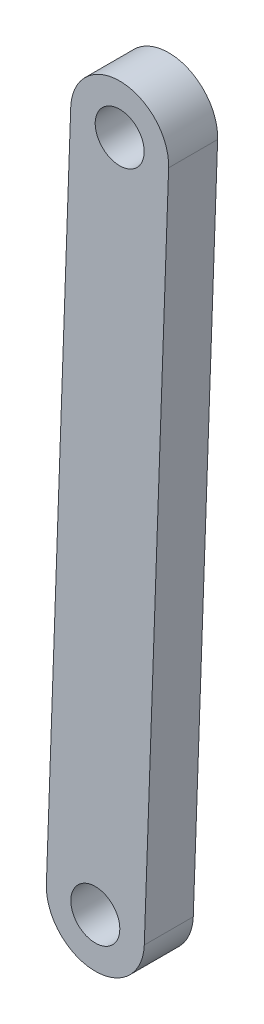
ISO-10303-21;
HEADER;
FILE_DESCRIPTION(('STEP AP214'),'2;1');
FILE_NAME('part.step','',(''),(''),'','','');
FILE_SCHEMA(('AUTOMOTIVE_DESIGN { 1 0 10303 214 1 1 1 1 }'));
ENDSEC;
DATA;
#1=APPLICATION_CONTEXT('core data for automotive mechanical design processes');
#2=APPLICATION_PROTOCOL_DEFINITION('international standard','automotive_design',2000,#1);
#3=PRODUCT_CONTEXT('',#1,'mechanical');
#4=PRODUCT('Part','Part','',(#3));
#5=PRODUCT_RELATED_PRODUCT_CATEGORY('part','',(#4));
#6=PRODUCT_DEFINITION_FORMATION('','',#4);
#7=PRODUCT_DEFINITION_CONTEXT('part definition',#1,'design');
#8=PRODUCT_DEFINITION('design','',#6,#7);
#9=PRODUCT_DEFINITION_SHAPE('','',#8);
#10=(LENGTH_UNIT() NAMED_UNIT(*) SI_UNIT(.MILLI.,.METRE.));
#11=(NAMED_UNIT(*) PLANE_ANGLE_UNIT() SI_UNIT($,.RADIAN.));
#12=(NAMED_UNIT(*) SI_UNIT($,.STERADIAN.) SOLID_ANGLE_UNIT());
#13=UNCERTAINTY_MEASURE_WITH_UNIT(LENGTH_MEASURE(1.E-05),#10,'distance_accuracy_value','');
#14=(GEOMETRIC_REPRESENTATION_CONTEXT(3) GLOBAL_UNCERTAINTY_ASSIGNED_CONTEXT((#13)) GLOBAL_UNIT_ASSIGNED_CONTEXT((#10,
#11,#12)) REPRESENTATION_CONTEXT('',''));
#15=CARTESIAN_POINT('',(0.,0.,0.));
#16=DIRECTION('',(0.,0.,1.));
#17=DIRECTION('',(1.,0.,0.));
#18=AXIS2_PLACEMENT_3D('',#15,#16,#17);
#19=CARTESIAN_POINT('',(102.486744604971,69.9558153499025,10.));
#20=DIRECTION('',(0.,0.,1.));
#21=DIRECTION('',(1.,0.,0.));
#22=AXIS2_PLACEMENT_3D('',#19,#20,#21);
#23=PLANE('',#22);
#24=CARTESIAN_POINT('',(100.,0.,10.));
#25=DIRECTION('',(0.,0.,1.));
#26=DIRECTION('',(1.,0.,0.));
#27=AXIS2_PLACEMENT_3D('',#24,#25,#26);
#28=CIRCLE('',#27,2.5);
#29=CARTESIAN_POINT('',(102.5,0.,10.));
#30=VERTEX_POINT('',#29);
#31=EDGE_CURVE('E106',#30,#30,#28,.T.);
#32=ORIENTED_EDGE('',*,*,#31,.F.);
#33=EDGE_LOOP('',(#32));
#34=FACE_BOUND('',#33,.T.);
#35=CARTESIAN_POINT('',(102.486744604971,69.9558153499025,10.));
#36=DIRECTION('',(0.,0.,1.));
#37=DIRECTION('',(1.,0.,0.));
#38=AXIS2_PLACEMENT_3D('',#35,#36,#37);
#39=CIRCLE('',#38,5.);
#40=CARTESIAN_POINT('',(107.483588558535,69.7781907352617,10.));
#41=VERTEX_POINT('',#40);
#42=CARTESIAN_POINT('',(97.4899006514063,70.1334399645432,10.));
#43=VERTEX_POINT('',#42);
#44=EDGE_CURVE('E91',#41,#43,#39,.T.);
#45=ORIENTED_EDGE('',*,*,#44,.T.);
#46=DIRECTION('',(-0.035524922928153,-0.999368790712892,0.));
#47=VECTOR('',#46,1.);
#48=CARTESIAN_POINT('',(97.4899006514063,70.1334399645432,10.));
#49=LINE('',#48,#47);
#50=CARTESIAN_POINT('',(95.0031560464355,0.177624614640765,10.));
#51=VERTEX_POINT('',#50);
#52=EDGE_CURVE('E86',#43,#51,#49,.T.);
#53=ORIENTED_EDGE('',*,*,#52,.T.);
#54=CARTESIAN_POINT('',(100.,0.,10.));
#55=DIRECTION('',(0.,0.,1.));
#56=DIRECTION('',(1.,0.,0.));
#57=AXIS2_PLACEMENT_3D('',#54,#55,#56);
#58=CIRCLE('',#57,5.);
#59=CARTESIAN_POINT('',(104.996843953564,-0.177624614640765,10.));
#60=VERTEX_POINT('',#59);
#61=EDGE_CURVE('E89',#51,#60,#58,.T.);
#62=ORIENTED_EDGE('',*,*,#61,.T.);
#63=DIRECTION('',(0.035524922928153,0.999368790712892,0.));
#64=VECTOR('',#63,1.);
#65=CARTESIAN_POINT('',(107.483588558535,69.7781907352617,10.));
#66=LINE('',#65,#64);
#67=EDGE_CURVE('E56',#60,#41,#66,.T.);
#68=ORIENTED_EDGE('',*,*,#67,.T.);
#69=EDGE_LOOP('',(#45,#53,#62,#68));
#70=FACE_BOUND('',#69,.T.);
#71=CARTESIAN_POINT('',(102.486744604971,69.9558153499025,10.));
#72=DIRECTION('',(0.,0.,1.));
#73=DIRECTION('',(1.,0.,0.));
#74=AXIS2_PLACEMENT_3D('',#71,#72,#73);
#75=CIRCLE('',#74,2.50000000000001);
#76=CARTESIAN_POINT('',(104.986744604971,69.9558153499025,10.));
#77=VERTEX_POINT('',#76);
#78=EDGE_CURVE('E121',#77,#77,#75,.T.);
#79=ORIENTED_EDGE('',*,*,#78,.F.);
#80=EDGE_LOOP('',(#79));
#81=FACE_BOUND('',#80,.T.);
#82=ADVANCED_FACE('F39',(#34,#70,#81),#23,.T.);
#83=CARTESIAN_POINT('',(102.486744604971,69.9558153499025,5.));
#84=DIRECTION('',(0.,0.,1.));
#85=DIRECTION('',(1.,0.,0.));
#86=AXIS2_PLACEMENT_3D('',#83,#84,#85);
#87=PLANE('',#86);
#88=CARTESIAN_POINT('',(102.486744604971,69.9558153499025,5.));
#89=DIRECTION('',(0.,0.,1.));
#90=DIRECTION('',(1.,0.,0.));
#91=AXIS2_PLACEMENT_3D('',#88,#89,#90);
#92=CIRCLE('',#91,5.);
#93=CARTESIAN_POINT('',(107.483588558535,69.7781907352617,5.));
#94=VERTEX_POINT('',#93);
#95=CARTESIAN_POINT('',(97.4899006514063,70.1334399645432,5.));
#96=VERTEX_POINT('',#95);
#97=EDGE_CURVE('E103',#94,#96,#92,.T.);
#98=ORIENTED_EDGE('',*,*,#97,.F.);
#99=DIRECTION('',(0.035524922928153,0.999368790712892,0.));
#100=VECTOR('',#99,1.);
#101=CARTESIAN_POINT('',(107.483588558535,69.7781907352617,5.));
#102=LINE('',#101,#100);
#103=CARTESIAN_POINT('',(104.996843953564,-0.177624614640765,5.));
#104=VERTEX_POINT('',#103);
#105=EDGE_CURVE('E79',#104,#94,#102,.T.);
#106=ORIENTED_EDGE('',*,*,#105,.F.);
#107=CARTESIAN_POINT('',(100.,0.,5.));
#108=DIRECTION('',(0.,0.,1.));
#109=DIRECTION('',(1.,0.,0.));
#110=AXIS2_PLACEMENT_3D('',#107,#108,#109);
#111=CIRCLE('',#110,5.);
#112=CARTESIAN_POINT('',(95.0031560464355,0.177624614640765,5.));
#113=VERTEX_POINT('',#112);
#114=EDGE_CURVE('E73',#113,#104,#111,.T.);
#115=ORIENTED_EDGE('',*,*,#114,.F.);
#116=DIRECTION('',(-0.035524922928153,-0.999368790712892,0.));
#117=VECTOR('',#116,1.);
#118=CARTESIAN_POINT('',(97.4899006514063,70.1334399645432,5.));
#119=LINE('',#118,#117);
#120=EDGE_CURVE('E95',#96,#113,#119,.T.);
#121=ORIENTED_EDGE('',*,*,#120,.F.);
#122=EDGE_LOOP('',(#98,#106,#115,#121));
#123=FACE_BOUND('',#122,.T.);
#124=CARTESIAN_POINT('',(100.,0.,5.));
#125=DIRECTION('',(0.,0.,1.));
#126=DIRECTION('',(1.,0.,0.));
#127=AXIS2_PLACEMENT_3D('',#124,#125,#126);
#128=CIRCLE('',#127,2.5);
#129=CARTESIAN_POINT('',(102.5,0.,5.));
#130=VERTEX_POINT('',#129);
#131=EDGE_CURVE('E118',#130,#130,#128,.T.);
#132=ORIENTED_EDGE('',*,*,#131,.T.);
#133=EDGE_LOOP('',(#132));
#134=FACE_BOUND('',#133,.T.);
#135=CARTESIAN_POINT('',(102.486744604971,69.9558153499025,5.));
#136=DIRECTION('',(0.,0.,1.));
#137=DIRECTION('',(1.,0.,0.));
#138=AXIS2_PLACEMENT_3D('',#135,#136,#137);
#139=CIRCLE('',#138,2.50000000000001);
#140=CARTESIAN_POINT('',(104.986744604971,69.9558153499025,5.));
#141=VERTEX_POINT('',#140);
#142=EDGE_CURVE('E124',#141,#141,#139,.T.);
#143=ORIENTED_EDGE('',*,*,#142,.T.);
#144=EDGE_LOOP('',(#143));
#145=FACE_BOUND('',#144,.T.);
#146=ADVANCED_FACE('F114',(#123,#134,#145),#87,.F.);
#147=CARTESIAN_POINT('',(102.486744604971,69.9558153499025,10.));
#148=DIRECTION('',(0.,0.,-1.));
#149=DIRECTION('',(-1.,0.,0.));
#150=AXIS2_PLACEMENT_3D('',#147,#148,#149);
#151=CYLINDRICAL_SURFACE('',#150,5.);
#152=ORIENTED_EDGE('',*,*,#97,.T.);
#153=DIRECTION('',(0.,0.,-1.));
#154=VECTOR('',#153,1.);
#155=CARTESIAN_POINT('',(97.4899006514063,70.1334399645432,10.));
#156=LINE('',#155,#154);
#157=EDGE_CURVE('E11',#43,#96,#156,.T.);
#158=ORIENTED_EDGE('',*,*,#157,.F.);
#159=ORIENTED_EDGE('',*,*,#44,.F.);
#160=DIRECTION('',(0.,0.,-1.));
#161=VECTOR('',#160,1.);
#162=CARTESIAN_POINT('',(107.483588558535,69.7781907352617,10.));
#163=LINE('',#162,#161);
#164=EDGE_CURVE('E99',#41,#94,#163,.T.);
#165=ORIENTED_EDGE('',*,*,#164,.T.);
#166=EDGE_LOOP('',(#152,#158,#159,#165));
#167=FACE_BOUND('',#166,.T.);
#168=ADVANCED_FACE('F41',(#167),#151,.T.);
#169=CARTESIAN_POINT('',(97.4899006514063,70.1334399645432,10.));
#170=DIRECTION('',(0.999368790712892,-0.035524922928153,0.));
#171=DIRECTION('',(0.035524922928153,0.999368790712892,0.));
#172=AXIS2_PLACEMENT_3D('',#169,#170,#171);
#173=PLANE('',#172);
#174=ORIENTED_EDGE('',*,*,#120,.T.);
#175=DIRECTION('',(0.,0.,-1.));
#176=VECTOR('',#175,1.);
#177=CARTESIAN_POINT('',(95.0031560464355,0.177624614640765,10.));
#178=LINE('',#177,#176);
#179=EDGE_CURVE('E48',#51,#113,#178,.T.);
#180=ORIENTED_EDGE('',*,*,#179,.F.);
#181=ORIENTED_EDGE('',*,*,#52,.F.);
#182=ORIENTED_EDGE('',*,*,#157,.T.);
#183=EDGE_LOOP('',(#174,#180,#181,#182));
#184=FACE_BOUND('',#183,.T.);
#185=ADVANCED_FACE('F94',(#184),#173,.F.);
#186=CARTESIAN_POINT('',(100.,0.,10.));
#187=DIRECTION('',(0.,0.,-1.));
#188=DIRECTION('',(-1.,0.,0.));
#189=AXIS2_PLACEMENT_3D('',#186,#187,#188);
#190=CYLINDRICAL_SURFACE('',#189,5.);
#191=ORIENTED_EDGE('',*,*,#114,.T.);
#192=DIRECTION('',(0.,0.,-1.));
#193=VECTOR('',#192,1.);
#194=CARTESIAN_POINT('',(104.996843953564,-0.177624614640765,10.));
#195=LINE('',#194,#193);
#196=EDGE_CURVE('E96',#60,#104,#195,.T.);
#197=ORIENTED_EDGE('',*,*,#196,.F.);
#198=ORIENTED_EDGE('',*,*,#61,.F.);
#199=ORIENTED_EDGE('',*,*,#179,.T.);
#200=EDGE_LOOP('',(#191,#197,#198,#199));
#201=FACE_BOUND('',#200,.T.);
#202=ADVANCED_FACE('F97',(#201),#190,.T.);
#203=CARTESIAN_POINT('',(107.483588558535,69.7781907352617,10.));
#204=DIRECTION('',(-0.999368790712892,0.035524922928153,0.));
#205=DIRECTION('',(-0.035524922928153,-0.999368790712893,0.));
#206=AXIS2_PLACEMENT_3D('',#203,#204,#205);
#207=PLANE('',#206);
#208=ORIENTED_EDGE('',*,*,#105,.T.);
#209=ORIENTED_EDGE('',*,*,#164,.F.);
#210=ORIENTED_EDGE('',*,*,#67,.F.);
#211=ORIENTED_EDGE('',*,*,#196,.T.);
#212=EDGE_LOOP('',(#208,#209,#210,#211));
#213=FACE_BOUND('',#212,.T.);
#214=ADVANCED_FACE('F111',(#213),#207,.F.);
#215=CARTESIAN_POINT('',(100.,0.,10.));
#216=DIRECTION('',(0.,0.,-1.));
#217=DIRECTION('',(-1.,0.,0.));
#218=AXIS2_PLACEMENT_3D('',#215,#216,#217);
#219=CYLINDRICAL_SURFACE('',#218,2.5);
#220=ORIENTED_EDGE('',*,*,#31,.T.);
#221=EDGE_LOOP('',(#220));
#222=FACE_BOUND('',#221,.T.);
#223=ORIENTED_EDGE('',*,*,#131,.F.);
#224=EDGE_LOOP('',(#223));
#225=FACE_BOUND('',#224,.T.);
#226=ADVANCED_FACE('F141',(#222,#225),#219,.F.);
#227=CARTESIAN_POINT('',(102.486744604971,69.9558153499025,10.));
#228=DIRECTION('',(0.,0.,-1.));
#229=DIRECTION('',(-1.,0.,0.));
#230=AXIS2_PLACEMENT_3D('',#227,#228,#229);
#231=CYLINDRICAL_SURFACE('',#230,2.50000000000001);
#232=ORIENTED_EDGE('',*,*,#78,.T.);
#233=EDGE_LOOP('',(#232));
#234=FACE_BOUND('',#233,.T.);
#235=ORIENTED_EDGE('',*,*,#142,.F.);
#236=EDGE_LOOP('',(#235));
#237=FACE_BOUND('',#236,.T.);
#238=ADVANCED_FACE('F130',(#234,#237),#231,.F.);
#239=CLOSED_SHELL('',(#82,#146,#168,#185,#202,#214,#226,#238));
#240=MANIFOLD_SOLID_BREP('B2',#239);
#241=ADVANCED_BREP_SHAPE_REPRESENTATION('',(#18,#240),#14);
#242=SHAPE_DEFINITION_REPRESENTATION(#9,#241);
ENDSEC;
END-ISO-10303-21;
